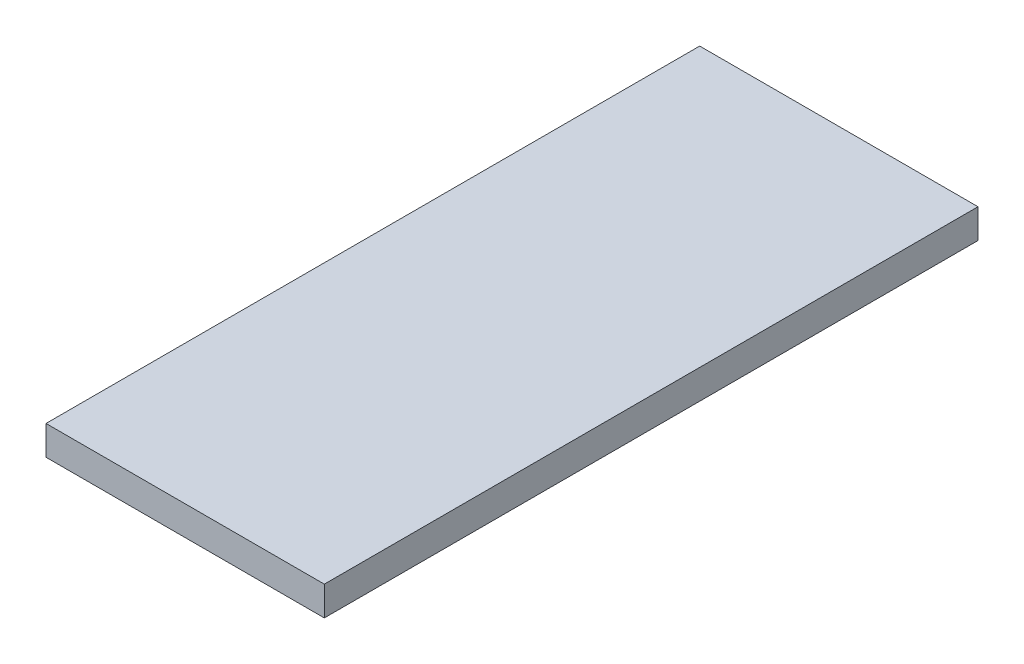
ISO-10303-21;
HEADER;
FILE_DESCRIPTION(('STEP AP214'),'2;1');
FILE_NAME('part.step','',(''),(''),'','','');
FILE_SCHEMA(('AUTOMOTIVE_DESIGN { 1 0 10303 214 1 1 1 1 }'));
ENDSEC;
DATA;
#1=APPLICATION_CONTEXT('core data for automotive mechanical design processes');
#2=APPLICATION_PROTOCOL_DEFINITION('international standard','automotive_design',2000,#1);
#3=PRODUCT_CONTEXT('',#1,'mechanical');
#4=PRODUCT('Part','Part','',(#3));
#5=PRODUCT_RELATED_PRODUCT_CATEGORY('part','',(#4));
#6=PRODUCT_DEFINITION_FORMATION('','',#4);
#7=PRODUCT_DEFINITION_CONTEXT('part definition',#1,'design');
#8=PRODUCT_DEFINITION('design','',#6,#7);
#9=PRODUCT_DEFINITION_SHAPE('','',#8);
#10=(LENGTH_UNIT() NAMED_UNIT(*) SI_UNIT(.MILLI.,.METRE.));
#11=(NAMED_UNIT(*) PLANE_ANGLE_UNIT() SI_UNIT($,.RADIAN.));
#12=(NAMED_UNIT(*) SI_UNIT($,.STERADIAN.) SOLID_ANGLE_UNIT());
#13=UNCERTAINTY_MEASURE_WITH_UNIT(LENGTH_MEASURE(1.E-05),#10,'distance_accuracy_value','');
#14=(GEOMETRIC_REPRESENTATION_CONTEXT(3) GLOBAL_UNCERTAINTY_ASSIGNED_CONTEXT((#13)) GLOBAL_UNIT_ASSIGNED_CONTEXT((#10,
#11,#12)) REPRESENTATION_CONTEXT('',''));
#15=CARTESIAN_POINT('',(0.,0.,0.));
#16=DIRECTION('',(0.,0.,1.));
#17=DIRECTION('',(1.,0.,0.));
#18=AXIS2_PLACEMENT_3D('',#15,#16,#17);
#19=CARTESIAN_POINT('',(-7.6,1.6,-17.85));
#20=DIRECTION('',(1.,0.,0.));
#21=DIRECTION('',(0.,0.,-1.));
#22=AXIS2_PLACEMENT_3D('',#19,#20,#21);
#23=PLANE('',#22);
#24=DIRECTION('',(0.,0.,1.));
#25=VECTOR('',#24,1.);
#26=CARTESIAN_POINT('',(-7.6,0.,-17.85));
#27=LINE('',#26,#25);
#28=CARTESIAN_POINT('',(-7.6,0.,-17.85));
#29=VERTEX_POINT('',#28);
#30=CARTESIAN_POINT('',(-7.6,0.,17.85));
#31=VERTEX_POINT('',#30);
#32=EDGE_CURVE('E98',#29,#31,#27,.T.);
#33=ORIENTED_EDGE('',*,*,#32,.T.);
#34=DIRECTION('',(0.,-1.,0.));
#35=VECTOR('',#34,1.);
#36=CARTESIAN_POINT('',(-7.6,1.6,17.85));
#37=LINE('',#36,#35);
#38=CARTESIAN_POINT('',(-7.6,1.6,17.85));
#39=VERTEX_POINT('',#38);
#40=EDGE_CURVE('E11',#39,#31,#37,.T.);
#41=ORIENTED_EDGE('',*,*,#40,.F.);
#42=DIRECTION('',(0.,0.,1.));
#43=VECTOR('',#42,1.);
#44=CARTESIAN_POINT('',(-7.6,1.6,-17.85));
#45=LINE('',#44,#43);
#46=CARTESIAN_POINT('',(-7.6,1.6,-17.85));
#47=VERTEX_POINT('',#46);
#48=EDGE_CURVE('E86',#47,#39,#45,.T.);
#49=ORIENTED_EDGE('',*,*,#48,.F.);
#50=DIRECTION('',(0.,-1.,0.));
#51=VECTOR('',#50,1.);
#52=CARTESIAN_POINT('',(-7.6,1.6,-17.85));
#53=LINE('',#52,#51);
#54=EDGE_CURVE('E94',#47,#29,#53,.T.);
#55=ORIENTED_EDGE('',*,*,#54,.T.);
#56=EDGE_LOOP('',(#33,#41,#49,#55));
#57=FACE_BOUND('',#56,.T.);
#58=ADVANCED_FACE('F35',(#57),#23,.F.);
#59=CARTESIAN_POINT('',(-7.6,1.6,17.85));
#60=DIRECTION('',(0.,0.,-1.));
#61=DIRECTION('',(-1.,0.,0.));
#62=AXIS2_PLACEMENT_3D('',#59,#60,#61);
#63=PLANE('',#62);
#64=DIRECTION('',(1.,0.,0.));
#65=VECTOR('',#64,1.);
#66=CARTESIAN_POINT('',(-7.6,0.,17.85));
#67=LINE('',#66,#65);
#68=CARTESIAN_POINT('',(7.60000000000001,0.,17.85));
#69=VERTEX_POINT('',#68);
#70=EDGE_CURVE('E90',#31,#69,#67,.T.);
#71=ORIENTED_EDGE('',*,*,#70,.T.);
#72=DIRECTION('',(0.,-1.,0.));
#73=VECTOR('',#72,1.);
#74=CARTESIAN_POINT('',(7.60000000000001,1.6,17.85));
#75=LINE('',#74,#73);
#76=CARTESIAN_POINT('',(7.60000000000001,1.6,17.85));
#77=VERTEX_POINT('',#76);
#78=EDGE_CURVE('E43',#77,#69,#75,.T.);
#79=ORIENTED_EDGE('',*,*,#78,.F.);
#80=DIRECTION('',(1.,0.,0.));
#81=VECTOR('',#80,1.);
#82=CARTESIAN_POINT('',(-7.6,1.6,17.85));
#83=LINE('',#82,#81);
#84=EDGE_CURVE('E81',#39,#77,#83,.T.);
#85=ORIENTED_EDGE('',*,*,#84,.F.);
#86=ORIENTED_EDGE('',*,*,#40,.T.);
#87=EDGE_LOOP('',(#71,#79,#85,#86));
#88=FACE_BOUND('',#87,.T.);
#89=ADVANCED_FACE('F89',(#88),#63,.F.);
#90=CARTESIAN_POINT('',(7.6,1.6,-17.85));
#91=DIRECTION('',(-1.,0.,0.));
#92=DIRECTION('',(0.,0.,1.));
#93=AXIS2_PLACEMENT_3D('',#90,#91,#92);
#94=PLANE('',#93);
#95=DIRECTION('',(0.,0.,-1.));
#96=VECTOR('',#95,1.);
#97=CARTESIAN_POINT('',(7.6,0.,-17.85));
#98=LINE('',#97,#96);
#99=CARTESIAN_POINT('',(7.6,0.,-17.85));
#100=VERTEX_POINT('',#99);
#101=EDGE_CURVE('E68',#69,#100,#98,.T.);
#102=ORIENTED_EDGE('',*,*,#101,.T.);
#103=DIRECTION('',(0.,-1.,0.));
#104=VECTOR('',#103,1.);
#105=CARTESIAN_POINT('',(7.6,1.6,-17.85));
#106=LINE('',#105,#104);
#107=CARTESIAN_POINT('',(7.6,1.6,-17.85));
#108=VERTEX_POINT('',#107);
#109=EDGE_CURVE('E91',#108,#100,#106,.T.);
#110=ORIENTED_EDGE('',*,*,#109,.F.);
#111=DIRECTION('',(0.,0.,-1.));
#112=VECTOR('',#111,1.);
#113=CARTESIAN_POINT('',(7.6,1.6,-17.85));
#114=LINE('',#113,#112);
#115=EDGE_CURVE('E84',#77,#108,#114,.T.);
#116=ORIENTED_EDGE('',*,*,#115,.F.);
#117=ORIENTED_EDGE('',*,*,#78,.T.);
#118=EDGE_LOOP('',(#102,#110,#116,#117));
#119=FACE_BOUND('',#118,.T.);
#120=ADVANCED_FACE('F92',(#119),#94,.F.);
#121=CARTESIAN_POINT('',(-7.6,1.6,-17.85));
#122=DIRECTION('',(0.,0.,1.));
#123=DIRECTION('',(1.,0.,0.));
#124=AXIS2_PLACEMENT_3D('',#121,#122,#123);
#125=PLANE('',#124);
#126=DIRECTION('',(-1.,0.,0.));
#127=VECTOR('',#126,1.);
#128=CARTESIAN_POINT('',(-7.6,0.,-17.85));
#129=LINE('',#128,#127);
#130=EDGE_CURVE('E74',#100,#29,#129,.T.);
#131=ORIENTED_EDGE('',*,*,#130,.T.);
#132=ORIENTED_EDGE('',*,*,#54,.F.);
#133=DIRECTION('',(-1.,0.,0.));
#134=VECTOR('',#133,1.);
#135=CARTESIAN_POINT('',(-7.6,1.6,-17.85));
#136=LINE('',#135,#134);
#137=EDGE_CURVE('E51',#108,#47,#136,.T.);
#138=ORIENTED_EDGE('',*,*,#137,.F.);
#139=ORIENTED_EDGE('',*,*,#109,.T.);
#140=EDGE_LOOP('',(#131,#132,#138,#139));
#141=FACE_BOUND('',#140,.T.);
#142=ADVANCED_FACE('F105',(#141),#125,.F.);
#143=CARTESIAN_POINT('',(0.,1.6,0.));
#144=DIRECTION('',(0.,1.,0.));
#145=DIRECTION('',(0.,0.,1.));
#146=AXIS2_PLACEMENT_3D('',#143,#144,#145);
#147=PLANE('',#146);
#148=ORIENTED_EDGE('',*,*,#48,.T.);
#149=ORIENTED_EDGE('',*,*,#84,.T.);
#150=ORIENTED_EDGE('',*,*,#115,.T.);
#151=ORIENTED_EDGE('',*,*,#137,.T.);
#152=EDGE_LOOP('',(#148,#149,#150,#151));
#153=FACE_BOUND('',#152,.T.);
#154=ADVANCED_FACE('F82',(#153),#147,.T.);
#155=CARTESIAN_POINT('',(0.,0.,0.));
#156=DIRECTION('',(0.,1.,0.));
#157=DIRECTION('',(0.,0.,1.));
#158=AXIS2_PLACEMENT_3D('',#155,#156,#157);
#159=PLANE('',#158);
#160=ORIENTED_EDGE('',*,*,#32,.F.);
#161=ORIENTED_EDGE('',*,*,#130,.F.);
#162=ORIENTED_EDGE('',*,*,#101,.F.);
#163=ORIENTED_EDGE('',*,*,#70,.F.);
#164=EDGE_LOOP('',(#160,#161,#162,#163));
#165=FACE_BOUND('',#164,.T.);
#166=ADVANCED_FACE('F108',(#165),#159,.F.);
#167=CLOSED_SHELL('',(#58,#89,#120,#142,#154,#166));
#168=MANIFOLD_SOLID_BREP('B2',#167);
#169=ADVANCED_BREP_SHAPE_REPRESENTATION('',(#18,#168),#14);
#170=SHAPE_DEFINITION_REPRESENTATION(#9,#169);
ENDSEC;
END-ISO-10303-21;
